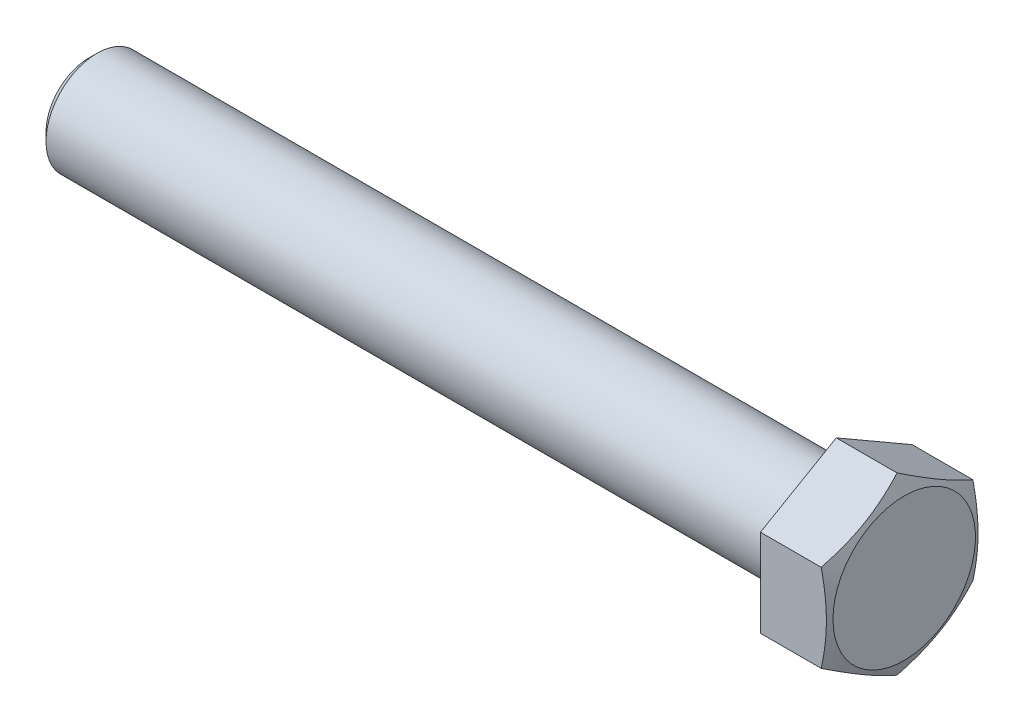
ISO-10303-21;
HEADER;
FILE_DESCRIPTION(('STEP AP214'),'2;1');
FILE_NAME('part.step','',(''),(''),'','','');
FILE_SCHEMA(('AUTOMOTIVE_DESIGN { 1 0 10303 214 1 1 1 1 }'));
ENDSEC;
DATA;
#1=APPLICATION_CONTEXT('core data for automotive mechanical design processes');
#2=APPLICATION_PROTOCOL_DEFINITION('international standard','automotive_design',2000,#1);
#3=PRODUCT_CONTEXT('',#1,'mechanical');
#4=PRODUCT('Part','Part','',(#3));
#5=PRODUCT_RELATED_PRODUCT_CATEGORY('part','',(#4));
#6=PRODUCT_DEFINITION_FORMATION('','',#4);
#7=PRODUCT_DEFINITION_CONTEXT('part definition',#1,'design');
#8=PRODUCT_DEFINITION('design','',#6,#7);
#9=PRODUCT_DEFINITION_SHAPE('','',#8);
#10=(LENGTH_UNIT() NAMED_UNIT(*) SI_UNIT(.MILLI.,.METRE.));
#11=(NAMED_UNIT(*) PLANE_ANGLE_UNIT() SI_UNIT($,.RADIAN.));
#12=(NAMED_UNIT(*) SI_UNIT($,.STERADIAN.) SOLID_ANGLE_UNIT());
#13=UNCERTAINTY_MEASURE_WITH_UNIT(LENGTH_MEASURE(1.E-05),#10,'distance_accuracy_value','');
#14=(GEOMETRIC_REPRESENTATION_CONTEXT(3) GLOBAL_UNCERTAINTY_ASSIGNED_CONTEXT((#13)) GLOBAL_UNIT_ASSIGNED_CONTEXT((#10,
#11,#12)) REPRESENTATION_CONTEXT('',''));
#15=CARTESIAN_POINT('',(0.,0.,0.));
#16=DIRECTION('',(0.,0.,1.));
#17=DIRECTION('',(1.,0.,0.));
#18=AXIS2_PLACEMENT_3D('',#15,#16,#17);
#19=CARTESIAN_POINT('',(0.,8.18290083527841,0.));
#20=DIRECTION('',(1.,0.,0.));
#21=DIRECTION('',(0.,0.,-1.));
#22=AXIS2_PLACEMENT_3D('',#19,#20,#21);
#23=PLANE('',#22);
#24=CARTESIAN_POINT('',(0.,0.,0.));
#25=DIRECTION('',(1.,0.,0.));
#26=DIRECTION('',(0.,0.,-1.));
#27=AXIS2_PLACEMENT_3D('',#24,#25,#26);
#28=CIRCLE('',#27,5.1435);
#29=CARTESIAN_POINT('',(0.,0.,-5.1435));
#30=VERTEX_POINT('',#29);
#31=EDGE_CURVE('E11',#30,#30,#28,.T.);
#32=ORIENTED_EDGE('',*,*,#31,.T.);
#33=EDGE_LOOP('',(#32));
#34=FACE_BOUND('',#33,.T.);
#35=DIRECTION('',(0.,0.5,0.866025403784439));
#36=VECTOR('',#35,1.);
#37=CARTESIAN_POINT('',(0.,4.0914504176392,-7.0866));
#38=LINE('',#37,#36);
#39=CARTESIAN_POINT('',(0.,4.0914504176392,-7.0866));
#40=VERTEX_POINT('',#39);
#41=CARTESIAN_POINT('',(0.,8.18290083527841,0.));
#42=VERTEX_POINT('',#41);
#43=EDGE_CURVE('E243',#40,#42,#38,.T.);
#44=ORIENTED_EDGE('',*,*,#43,.F.);
#45=DIRECTION('',(0.,1.,0.));
#46=VECTOR('',#45,1.);
#47=CARTESIAN_POINT('',(0.,-4.09145041763921,-7.0866));
#48=LINE('',#47,#46);
#49=CARTESIAN_POINT('',(0.,-4.09145041763921,-7.0866));
#50=VERTEX_POINT('',#49);
#51=EDGE_CURVE('E236',#50,#40,#48,.T.);
#52=ORIENTED_EDGE('',*,*,#51,.F.);
#53=DIRECTION('',(0.,0.499999999999999,-0.866025403784439));
#54=VECTOR('',#53,1.);
#55=CARTESIAN_POINT('',(0.,-8.1829008352784,0.));
#56=LINE('',#55,#54);
#57=CARTESIAN_POINT('',(0.,-8.1829008352784,0.));
#58=VERTEX_POINT('',#57);
#59=EDGE_CURVE('E238',#58,#50,#56,.T.);
#60=ORIENTED_EDGE('',*,*,#59,.F.);
#61=DIRECTION('',(0.,-0.5,-0.866025403784439));
#62=VECTOR('',#61,1.);
#63=CARTESIAN_POINT('',(0.,-4.0914504176392,7.08660000000001));
#64=LINE('',#63,#62);
#65=CARTESIAN_POINT('',(0.,-4.0914504176392,7.08660000000001));
#66=VERTEX_POINT('',#65);
#67=EDGE_CURVE('E229',#66,#58,#64,.T.);
#68=ORIENTED_EDGE('',*,*,#67,.F.);
#69=DIRECTION('',(0.,-1.,0.));
#70=VECTOR('',#69,1.);
#71=CARTESIAN_POINT('',(0.,4.09145041763921,7.08660000000001));
#72=LINE('',#71,#70);
#73=CARTESIAN_POINT('',(0.,4.09145041763921,7.08660000000001));
#74=VERTEX_POINT('',#73);
#75=EDGE_CURVE('E241',#74,#66,#72,.T.);
#76=ORIENTED_EDGE('',*,*,#75,.F.);
#77=DIRECTION('',(0.,-0.5,0.866025403784438));
#78=VECTOR('',#77,1.);
#79=CARTESIAN_POINT('',(0.,8.18290083527841,0.));
#80=LINE('',#79,#78);
#81=EDGE_CURVE('E119',#42,#74,#80,.T.);
#82=ORIENTED_EDGE('',*,*,#81,.F.);
#83=EDGE_LOOP('',(#44,#52,#60,#68,#76,#82));
#84=FACE_BOUND('',#83,.T.);
#85=ADVANCED_FACE('F45',(#34,#84),#23,.F.);
#86=CARTESIAN_POINT('',(6.35,4.0914504176392,-7.0866));
#87=DIRECTION('',(0.,-0.866025403784439,0.5));
#88=DIRECTION('',(0.,-0.5,-0.866025403784439));
#89=AXIS2_PLACEMENT_3D('',#86,#87,#88);
#90=PLANE('',#89);
#91=DIRECTION('',(-1.,0.,0.));
#92=VECTOR('',#91,1.);
#93=CARTESIAN_POINT('',(6.35,8.18290083527841,0.));
#94=LINE('',#93,#92);
#95=CARTESIAN_POINT('',(5.67731061007736,8.18290083527841,0.));
#96=VERTEX_POINT('',#95);
#97=EDGE_CURVE('E121',#96,#42,#94,.T.);
#98=ORIENTED_EDGE('',*,*,#97,.F.);
#99=CARTESIAN_POINT('',(5.67725964083577,8.18301630533225,0.000200000000013089));
#100=CARTESIAN_POINT('',(5.73498426844191,8.05224265346828,-0.226306609319698));
#101=CARTESIAN_POINT('',(5.78876680280309,7.92100668629218,-0.453613972249148));
#102=CARTESIAN_POINT('',(5.88703548005851,7.65759582233643,-0.90985497188613));
#103=CARTESIAN_POINT('',(5.93151641594971,7.52542044225308,-1.13878944570021));
#104=CARTESIAN_POINT('',(6.0097207616842,7.26019903494239,-1.59816639841724));
#105=CARTESIAN_POINT('',(6.04343900285222,7.12715262061477,-1.82860954779754));
#106=CARTESIAN_POINT('',(6.09876221501083,6.86045060232067,-2.29055099396408));
#107=CARTESIAN_POINT('',(6.12036960619603,6.72679512545318,-2.52204907060842));
#108=CARTESIAN_POINT('',(6.15022630561397,6.46168922070597,-2.98122596701711));
#109=CARTESIAN_POINT('',(6.15872487254714,6.33024590211084,-3.20889247313933));
#110=CARTESIAN_POINT('',(6.16275943678103,6.06729935157837,-3.66432925833656));
#111=CARTESIAN_POINT('',(6.15829453746928,5.93579611612587,-3.89209954349999));
#112=CARTESIAN_POINT('',(6.13661867029556,5.6731648318318,-4.34699027155438));
#113=CARTESIAN_POINT('',(6.11941811219794,5.54203656432467,-4.57411109318521));
#114=CARTESIAN_POINT('',(6.07304545639624,5.28032704553691,-5.02740527655001));
#115=CARTESIAN_POINT('',(6.0438744884099,5.14974574381042,-5.25357872565877));
#116=CARTESIAN_POINT('',(5.9886673396374,4.94184296707828,-5.6136768979935));
#117=CARTESIAN_POINT('',(5.96611276599631,4.86428398906851,-5.74801298848953));
#118=CARTESIAN_POINT('',(5.91743873398993,4.70945456271683,-6.01618542143738));
#119=CARTESIAN_POINT('',(5.89131967804329,4.63218408281466,-6.15002181855317));
#120=CARTESIAN_POINT('',(5.83563492250009,4.47747089379907,-6.41799292252917));
#121=CARTESIAN_POINT('',(5.80604923179578,4.40002999419904,-6.55212449522028));
#122=CARTESIAN_POINT('',(5.74385147845469,4.24545310294259,-6.81985952455249));
#123=CARTESIAN_POINT('',(5.71123945146082,4.16831710770631,-6.95346298739412));
#124=CARTESIAN_POINT('',(5.67725964083578,4.09133494758537,-7.0868));
#125=B_SPLINE_CURVE_WITH_KNOTS('',3,(#99,#100,#101,#102,#103,#104,#105,#106,#107,#108,#109,#110,
#111,#112,#113,#114,#115,#116,#117,#118,#119,#120,#121,#122,#123,#124),.UNSPECIFIED.,.F.,.F.,(4,
2,2,2,2,2,2,2,2,2,2,2,4),(0.,0.803574319548981,1.60759728011387,2.41200578565302,
3.21625348333088,4.00501154803446,4.79382416814302,5.58199274608049,6.37008695703105,
6.84029706564725,7.31045413289375,7.78346991165116,8.25648012013805),.UNSPECIFIED.);
#126=CARTESIAN_POINT('',(5.67731061007736,4.09145041763921,-7.0866));
#127=VERTEX_POINT('',#126);
#128=EDGE_CURVE('E103',#96,#127,#125,.T.);
#129=ORIENTED_EDGE('',*,*,#128,.T.);
#130=DIRECTION('',(-1.,0.,0.));
#131=VECTOR('',#130,1.);
#132=CARTESIAN_POINT('',(6.35,4.0914504176392,-7.0866));
#133=LINE('',#132,#131);
#134=EDGE_CURVE('E68',#127,#40,#133,.T.);
#135=ORIENTED_EDGE('',*,*,#134,.T.);
#136=ORIENTED_EDGE('',*,*,#43,.T.);
#137=EDGE_LOOP('',(#98,#129,#135,#136));
#138=FACE_BOUND('',#137,.T.);
#139=ADVANCED_FACE('F149',(#138),#90,.F.);
#140=CARTESIAN_POINT('',(6.35,8.18290083527841,0.));
#141=DIRECTION('',(0.,-0.866025403784438,-0.5));
#142=DIRECTION('',(0.,0.5,-0.866025403784438));
#143=AXIS2_PLACEMENT_3D('',#140,#141,#142);
#144=PLANE('',#143);
#145=DIRECTION('',(-1.,0.,0.));
#146=VECTOR('',#145,1.);
#147=CARTESIAN_POINT('',(6.35,4.09145041763921,7.08660000000001));
#148=LINE('',#147,#146);
#149=CARTESIAN_POINT('',(5.67731061007736,4.0914504176392,7.08660000000001));
#150=VERTEX_POINT('',#149);
#151=EDGE_CURVE('E112',#150,#74,#148,.T.);
#152=ORIENTED_EDGE('',*,*,#151,.F.);
#153=CARTESIAN_POINT('',(5.67725964083577,4.09133494758537,7.0868));
#154=CARTESIAN_POINT('',(5.73498426844191,4.22210859944934,6.86029339068029));
#155=CARTESIAN_POINT('',(5.78876680280309,4.35334456662544,6.63298602775085));
#156=CARTESIAN_POINT('',(5.88703548005851,4.61675543058119,6.17674502811386));
#157=CARTESIAN_POINT('',(5.93151641594971,4.74893081066454,5.94781055429979));
#158=CARTESIAN_POINT('',(6.0097207616842,5.01415221797522,5.48843360158275));
#159=CARTESIAN_POINT('',(6.04343900285222,5.14719863230285,5.25799045220245));
#160=CARTESIAN_POINT('',(6.09876221501083,5.41390065059694,4.79604900603591));
#161=CARTESIAN_POINT('',(6.12036960619602,5.54755612746443,4.56455092939157));
#162=CARTESIAN_POINT('',(6.15022630561396,5.81266203221165,4.10537403298288));
#163=CARTESIAN_POINT('',(6.15872487254714,5.94410535080677,3.87770752686066));
#164=CARTESIAN_POINT('',(6.16275943678103,6.20705190133925,3.42227074166344));
#165=CARTESIAN_POINT('',(6.15829453746928,6.33855513679175,3.19450045650001));
#166=CARTESIAN_POINT('',(6.13661867029556,6.60118642108582,2.73960972844561));
#167=CARTESIAN_POINT('',(6.11941811219793,6.73231468859295,2.51248890681479));
#168=CARTESIAN_POINT('',(6.07304545639623,6.99402420738071,2.05919472344999));
#169=CARTESIAN_POINT('',(6.04387448840989,7.12460550910719,1.83302127434123));
#170=CARTESIAN_POINT('',(5.9886673396374,7.33250828583934,1.4729231020065));
#171=CARTESIAN_POINT('',(5.9661127659963,7.41006726384911,1.33858701151047));
#172=CARTESIAN_POINT('',(5.91743873398992,7.56489669020079,1.07041457856262));
#173=CARTESIAN_POINT('',(5.89131967804329,7.64216717010296,0.936578181446833));
#174=CARTESIAN_POINT('',(5.83563492250009,7.79688035911854,0.668607077470833));
#175=CARTESIAN_POINT('',(5.80604923179577,7.87432125871858,0.534475504779727));
#176=CARTESIAN_POINT('',(5.74385147845469,8.02889814997502,0.266740475447522));
#177=CARTESIAN_POINT('',(5.71123945146082,8.10603414521131,0.133137012605887));
#178=CARTESIAN_POINT('',(5.67725964083578,8.18301630533225,-0.000199999999987229));
#179=B_SPLINE_CURVE_WITH_KNOTS('',3,(#153,#154,#155,#156,#157,#158,#159,#160,#161,#162,#163,
#164,#165,#166,#167,#168,#169,#170,#171,#172,#173,#174,#175,#176,#177,#178),.UNSPECIFIED.,.F.,
.F.,(4,2,2,2,2,2,2,2,2,2,2,2,4),(0.,0.80357431954898,1.60759728011386,2.41200578565302,
3.21625348333088,4.00501154803445,4.79382416814301,5.58199274608049,6.37008695703105,
6.84029706564724,7.31045413289374,7.78346991165115,8.25648012013803),.UNSPECIFIED.);
#180=EDGE_CURVE('E98',#150,#96,#179,.T.);
#181=ORIENTED_EDGE('',*,*,#180,.T.);
#182=ORIENTED_EDGE('',*,*,#97,.T.);
#183=ORIENTED_EDGE('',*,*,#81,.T.);
#184=EDGE_LOOP('',(#152,#181,#182,#183));
#185=FACE_BOUND('',#184,.T.);
#186=ADVANCED_FACE('F117',(#185),#144,.F.);
#187=CARTESIAN_POINT('',(6.35,4.09145041763921,7.08660000000001));
#188=DIRECTION('',(0.,0.,-1.));
#189=DIRECTION('',(-1.,0.,0.));
#190=AXIS2_PLACEMENT_3D('',#187,#188,#189);
#191=PLANE('',#190);
#192=DIRECTION('',(-1.,0.,0.));
#193=VECTOR('',#192,1.);
#194=CARTESIAN_POINT('',(6.35,-4.0914504176392,7.08660000000001));
#195=LINE('',#194,#193);
#196=CARTESIAN_POINT('',(5.67731061007736,-4.09145041763921,7.0866));
#197=VERTEX_POINT('',#196);
#198=EDGE_CURVE('E114',#197,#66,#195,.T.);
#199=ORIENTED_EDGE('',*,*,#198,.F.);
#200=CARTESIAN_POINT('',(3.57934101398234,-10.8221130385265,7.08660000000001));
#201=CARTESIAN_POINT('',(3.6970608265251,-10.5032304606957,7.08660000000001));
#202=CARTESIAN_POINT('',(3.81346668097632,-10.1838536520814,7.08660000000001));
#203=CARTESIAN_POINT('',(4.04290950724388,-9.54385200397452,7.08660000000001));
#204=CARTESIAN_POINT('',(4.15594608806952,-9.2232270244803,7.08660000000001));
#205=CARTESIAN_POINT('',(4.378213393869,-8.57958295632354,7.08660000000001));
#206=CARTESIAN_POINT('',(4.48743173829045,-8.25655957670765,7.08660000000001));
#207=CARTESIAN_POINT('',(4.7006596279205,-7.60880243001671,7.08660000000001));
#208=CARTESIAN_POINT('',(4.8046693318549,-7.28406871539534,7.08660000000001));
#209=CARTESIAN_POINT('',(5.00480734465554,-6.63690000136647,7.08660000000001));
#210=CARTESIAN_POINT('',(5.1010220695284,-6.31449186094321,7.08660000000001));
#211=CARTESIAN_POINT('',(5.28543385790487,-5.66735918833097,7.08660000000001));
#212=CARTESIAN_POINT('',(5.3736305825733,-5.34263455887355,7.08660000000001));
#213=CARTESIAN_POINT('',(5.53985581267927,-4.69085046575492,7.08660000000001));
#214=CARTESIAN_POINT('',(5.61789245815599,-4.36379309542186,7.08660000000001));
#215=CARTESIAN_POINT('',(5.76136105520319,-3.70691841444896,7.08660000000001));
#216=CARTESIAN_POINT('',(5.8267944100109,-3.37710141533488,7.08660000000001));
#217=CARTESIAN_POINT('',(5.92631904424136,-2.80609894004356,7.08660000000001));
#218=CARTESIAN_POINT('',(5.96407737712296,-2.56555389903237,7.08660000000001));
#219=CARTESIAN_POINT('',(6.03042987065936,-2.08320947620496,7.08660000000001));
#220=CARTESIAN_POINT('',(6.05902483253493,-1.84141020593495,7.08660000000001));
#221=CARTESIAN_POINT('',(6.10609370816598,-1.35694594642842,7.08660000000001));
#222=CARTESIAN_POINT('',(6.12457291865864,-1.1142814773495,7.08660000000001));
#223=CARTESIAN_POINT('',(6.15074600795437,-0.62836625342249,7.08660000000001));
#224=CARTESIAN_POINT('',(6.15843997244842,-0.385115503247903,7.08660000000001));
#225=CARTESIAN_POINT('',(6.16274684776516,0.102597811828056,7.08660000000001));
#226=CARTESIAN_POINT('',(6.15930894477468,0.347060833301929,7.08660000000001));
#227=CARTESIAN_POINT('',(6.14137944957125,0.835578610055077,7.08660000000001));
#228=CARTESIAN_POINT('',(6.12688770669587,1.07963335972422,7.08660000000001));
#229=CARTESIAN_POINT('',(6.0874048619863,1.56697643839187,7.08660000000001));
#230=CARTESIAN_POINT('',(6.06240982261145,1.8102644454525,7.08660000000001));
#231=CARTESIAN_POINT('',(6.00279655599724,2.2956325414133,7.08660000000001));
#232=CARTESIAN_POINT('',(5.96817851044868,2.53771265303177,7.08660000000001));
#233=CARTESIAN_POINT('',(5.82927711889676,3.39973777309047,7.08660000000001));
#234=CARTESIAN_POINT('',(5.70098592872945,4.015868511235,7.08660000000001));
#235=CARTESIAN_POINT('',(5.47967922017748,4.93290030259767,7.08660000000001));
#236=CARTESIAN_POINT('',(5.40105055646677,5.23753908379362,7.08660000000001));
#237=CARTESIAN_POINT('',(5.23597283247687,5.84470028340484,7.08660000000001));
#238=CARTESIAN_POINT('',(5.14952418772888,6.14722281335237,7.08660000000001));
#239=CARTESIAN_POINT('',(4.96995427648391,6.75167380381394,7.08660000000001));
#240=CARTESIAN_POINT('',(4.87680594754326,7.05359413309933,7.08660000000001));
#241=CARTESIAN_POINT('',(4.68538917821675,7.6558067852736,7.08660000000001));
#242=CARTESIAN_POINT('',(4.58712069102852,7.95609909325334,7.08660000000001));
#243=CARTESIAN_POINT('',(4.386476784684,8.55516665694746,7.08660000000001));
#244=CARTESIAN_POINT('',(4.28410306500147,8.85394248390486,7.08660000000001));
#245=CARTESIAN_POINT('',(4.07596459102404,9.45031251322853,7.08660000000001));
#246=CARTESIAN_POINT('',(3.97019978746287,9.74790669835705,7.08660000000001));
#247=CARTESIAN_POINT('',(3.64901478410276,10.6384621293328,7.08660000000001));
#248=CARTESIAN_POINT('',(3.42945485483155,11.2299295560444,7.08660000000001));
#249=CARTESIAN_POINT('',(2.98268967135271,12.4100238931381,7.08660000000001));
#250=CARTESIAN_POINT('',(2.75548358026536,12.9986504844733,7.08660000000001));
#251=CARTESIAN_POINT('',(2.29792303408043,14.1678084306438,7.08660000000001));
#252=CARTESIAN_POINT('',(2.06762374085286,14.7483614100218,7.08660000000001));
#253=CARTESIAN_POINT('',(1.71922089692624,15.6179430097297,7.08660000000001));
#254=CARTESIAN_POINT('',(1.6026048978233,15.9075696248717,7.08660000000001));
#255=CARTESIAN_POINT('',(1.36850511519232,16.4864703338818,7.08660000000001));
#256=CARTESIAN_POINT('',(1.25102133597472,16.7757444294926,7.08660000000001));
#257=CARTESIAN_POINT('',(1.13316480798833,17.0648666782435,7.08660000000001));
#258=B_SPLINE_CURVE_WITH_KNOTS('',3,(#200,#201,#202,#203,#204,#205,#206,#207,#208,#209,#210,
#211,#212,#213,#214,#215,#216,#217,#218,#219,#220,#221,#222,#223,#224,#225,#226,#227,#228,#229,
#230,#231,#232,#233,#234,#235,#236,#237,#238,#239,#240,#241,#242,#243,#244,#245,#246,#247,#248,
#249,#250,#251,#252,#253,#254,#255,#256,#257),.UNSPECIFIED.,.F.,.F.,(4,2,2,2,2,2,2,2,2,2,2,2,2,
2,2,2,2,2,2,2,2,2,2,2,2,2,2,2,4),(0.,1.01976313202464,2.0396441463499,3.06257243957305,
4.0854695415403,5.09476376616394,6.10410062305953,7.11262377824851,8.12103458053186,
8.85135521541389,9.58161197556924,10.3114859972767,11.0413542199536,11.7745587723033,
12.5077733183153,13.2412629818912,13.9747387974787,15.860459858621,16.8042963676543,
17.7480827533707,18.6959224236646,19.6437707594949,20.5912306783425,21.5387043682982,
23.4313287565979,25.32416097251,27.1978300917938,28.1344965228614,29.071158304447),.UNSPECIFIED.);
#259=EDGE_CURVE('E101',#197,#150,#258,.T.);
#260=ORIENTED_EDGE('',*,*,#259,.T.);
#261=ORIENTED_EDGE('',*,*,#151,.T.);
#262=ORIENTED_EDGE('',*,*,#75,.T.);
#263=EDGE_LOOP('',(#199,#260,#261,#262));
#264=FACE_BOUND('',#263,.T.);
#265=ADVANCED_FACE('F110',(#264),#191,.F.);
#266=CARTESIAN_POINT('',(6.35,-4.0914504176392,7.08660000000001));
#267=DIRECTION('',(0.,0.866025403784439,-0.5));
#268=DIRECTION('',(0.,0.5,0.866025403784439));
#269=AXIS2_PLACEMENT_3D('',#266,#267,#268);
#270=PLANE('',#269);
#271=DIRECTION('',(-1.,0.,0.));
#272=VECTOR('',#271,1.);
#273=CARTESIAN_POINT('',(6.35,-8.1829008352784,0.));
#274=LINE('',#273,#272);
#275=CARTESIAN_POINT('',(5.67731061007736,-8.18290083527841,0.));
#276=VERTEX_POINT('',#275);
#277=EDGE_CURVE('E125',#276,#58,#274,.T.);
#278=ORIENTED_EDGE('',*,*,#277,.F.);
#279=CARTESIAN_POINT('',(5.67725964083578,-8.18301630533224,-0.0001999999999975));
#280=CARTESIAN_POINT('',(5.73498426844192,-8.05224265346827,0.226306609319714));
#281=CARTESIAN_POINT('',(5.78876680280309,-7.92100668629218,0.453613972249163));
#282=CARTESIAN_POINT('',(5.88703548005851,-7.65759582233642,0.909854971886144));
#283=CARTESIAN_POINT('',(5.93151641594972,-7.52542044225308,1.13878944570022));
#284=CARTESIAN_POINT('',(6.0097207616842,-7.26019903494239,1.59816639841725));
#285=CARTESIAN_POINT('',(6.04343900285222,-7.12715262061477,1.82860954779756));
#286=CARTESIAN_POINT('',(6.09876221501083,-6.86045060232067,2.29055099396409));
#287=CARTESIAN_POINT('',(6.12036960619603,-6.72679512545318,2.52204907060844));
#288=CARTESIAN_POINT('',(6.15022630561397,-6.46168922070597,2.98122596701712));
#289=CARTESIAN_POINT('',(6.15872487254714,-6.33024590211084,3.20889247313935));
#290=CARTESIAN_POINT('',(6.16275943678103,-6.06729935157837,3.66432925833657));
#291=CARTESIAN_POINT('',(6.15829453746928,-5.93579611612586,3.8920995435));
#292=CARTESIAN_POINT('',(6.13661867029556,-5.67316483183179,4.34699027155439));
#293=CARTESIAN_POINT('',(6.11941811219794,-5.54203656432467,4.57411109318522));
#294=CARTESIAN_POINT('',(6.07304545639623,-5.28032704553691,5.02740527655001));
#295=CARTESIAN_POINT('',(6.0438744884099,-5.14974574381042,5.25357872565877));
#296=CARTESIAN_POINT('',(5.9886673396374,-4.94184296707828,5.6136768979935));
#297=CARTESIAN_POINT('',(5.96611276599631,-4.86428398906851,5.74801298848954));
#298=CARTESIAN_POINT('',(5.91743873398992,-4.70945456271683,6.01618542143739));
#299=CARTESIAN_POINT('',(5.89131967804329,-4.63218408281466,6.15002181855318));
#300=CARTESIAN_POINT('',(5.83563492250009,-4.47747089379907,6.41799292252918));
#301=CARTESIAN_POINT('',(5.80604923179577,-4.40002999419904,6.55212449522029));
#302=CARTESIAN_POINT('',(5.74385147845469,-4.24545310294259,6.81985952455249));
#303=CARTESIAN_POINT('',(5.71123945146082,-4.16831710770631,6.95346298739413));
#304=CARTESIAN_POINT('',(5.67725964083578,-4.09133494758537,7.0868));
#305=B_SPLINE_CURVE_WITH_KNOTS('',3,(#279,#280,#281,#282,#283,#284,#285,#286,#287,#288,#289,
#290,#291,#292,#293,#294,#295,#296,#297,#298,#299,#300,#301,#302,#303,#304),.UNSPECIFIED.,.F.,
.F.,(4,2,2,2,2,2,2,2,2,2,2,2,4),(0.,0.803574319548979,1.60759728011386,2.41200578565302,
3.21625348333088,4.00501154803445,4.79382416814301,5.58199274608048,6.37008695703104,
6.84029706564724,7.31045413289374,7.78346991165115,8.25648012013804),.UNSPECIFIED.);
#306=EDGE_CURVE('E115',#276,#197,#305,.T.);
#307=ORIENTED_EDGE('',*,*,#306,.T.);
#308=ORIENTED_EDGE('',*,*,#198,.T.);
#309=ORIENTED_EDGE('',*,*,#67,.T.);
#310=EDGE_LOOP('',(#278,#307,#308,#309));
#311=FACE_BOUND('',#310,.T.);
#312=ADVANCED_FACE('F218',(#311),#270,.F.);
#313=CARTESIAN_POINT('',(6.35,-8.1829008352784,0.));
#314=DIRECTION('',(0.,0.866025403784439,0.499999999999999));
#315=DIRECTION('',(0.,-0.499999999999999,0.866025403784439));
#316=AXIS2_PLACEMENT_3D('',#313,#314,#315);
#317=PLANE('',#316);
#318=DIRECTION('',(-1.,0.,0.));
#319=VECTOR('',#318,1.);
#320=CARTESIAN_POINT('',(6.35,-4.09145041763921,-7.0866));
#321=LINE('',#320,#319);
#322=CARTESIAN_POINT('',(5.67731061007736,-4.09145041763921,-7.0866));
#323=VERTEX_POINT('',#322);
#324=EDGE_CURVE('E232',#323,#50,#321,.T.);
#325=ORIENTED_EDGE('',*,*,#324,.F.);
#326=CARTESIAN_POINT('',(5.67725964083578,-4.09133494758537,-7.0868));
#327=CARTESIAN_POINT('',(5.73498426844192,-4.22210859944933,-6.86029339068029));
#328=CARTESIAN_POINT('',(5.78876680280309,-4.35334456662544,-6.63298602775084));
#329=CARTESIAN_POINT('',(5.88703548005851,-4.61675543058119,-6.17674502811386));
#330=CARTESIAN_POINT('',(5.93151641594971,-4.74893081066453,-5.94781055429978));
#331=CARTESIAN_POINT('',(6.0097207616842,-5.01415221797522,-5.48843360158275));
#332=CARTESIAN_POINT('',(6.04343900285222,-5.14719863230284,-5.25799045220245));
#333=CARTESIAN_POINT('',(6.09876221501083,-5.41390065059694,-4.79604900603591));
#334=CARTESIAN_POINT('',(6.12036960619603,-5.54755612746443,-4.56455092939156));
#335=CARTESIAN_POINT('',(6.15022630561397,-5.81266203221164,-4.10537403298288));
#336=CARTESIAN_POINT('',(6.15872487254714,-5.94410535080677,-3.87770752686066));
#337=CARTESIAN_POINT('',(6.16275943678103,-6.20705190133924,-3.42227074166343));
#338=CARTESIAN_POINT('',(6.15829453746928,-6.33855513679175,-3.1945004565));
#339=CARTESIAN_POINT('',(6.13661867029556,-6.60118642108581,-2.73960972844561));
#340=CARTESIAN_POINT('',(6.11941811219794,-6.73231468859294,-2.51248890681478));
#341=CARTESIAN_POINT('',(6.07304545639623,-6.9940242073807,-2.05919472344999));
#342=CARTESIAN_POINT('',(6.0438744884099,-7.12460550910719,-1.83302127434123));
#343=CARTESIAN_POINT('',(5.9886673396374,-7.33250828583933,-1.4729231020065));
#344=CARTESIAN_POINT('',(5.96611276599631,-7.4100672638491,-1.33858701151046));
#345=CARTESIAN_POINT('',(5.91743873398992,-7.56489669020078,-1.07041457856261));
#346=CARTESIAN_POINT('',(5.89131967804329,-7.64216717010295,-0.936578181446825));
#347=CARTESIAN_POINT('',(5.83563492250009,-7.79688035911853,-0.668607077470823));
#348=CARTESIAN_POINT('',(5.80604923179578,-7.87432125871857,-0.534475504779716));
#349=CARTESIAN_POINT('',(5.74385147845469,-8.02889814997502,-0.266740475447509));
#350=CARTESIAN_POINT('',(5.71123945146082,-8.1060341452113,-0.133137012605873));
#351=CARTESIAN_POINT('',(5.67725964083578,-8.18301630533224,0.000200000000002315));
#352=B_SPLINE_CURVE_WITH_KNOTS('',3,(#326,#327,#328,#329,#330,#331,#332,#333,#334,#335,#336,
#337,#338,#339,#340,#341,#342,#343,#344,#345,#346,#347,#348,#349,#350,#351),.UNSPECIFIED.,.F.,
.F.,(4,2,2,2,2,2,2,2,2,2,2,2,4),(0.,0.803574319548979,1.60759728011386,2.41200578565302,
3.21625348333088,4.00501154803445,4.79382416814301,5.58199274608048,6.37008695703104,
6.84029706564724,7.31045413289374,7.78346991165115,8.25648012013804),.UNSPECIFIED.);
#353=EDGE_CURVE('E60',#323,#276,#352,.T.);
#354=ORIENTED_EDGE('',*,*,#353,.T.);
#355=ORIENTED_EDGE('',*,*,#277,.T.);
#356=ORIENTED_EDGE('',*,*,#59,.T.);
#357=EDGE_LOOP('',(#325,#354,#355,#356));
#358=FACE_BOUND('',#357,.T.);
#359=ADVANCED_FACE('F165',(#358),#317,.F.);
#360=CARTESIAN_POINT('',(6.35,-4.09145041763921,-7.0866));
#361=DIRECTION('',(0.,0.,1.));
#362=DIRECTION('',(1.,0.,0.));
#363=AXIS2_PLACEMENT_3D('',#360,#361,#362);
#364=PLANE('',#363);
#365=ORIENTED_EDGE('',*,*,#134,.F.);
#366=CARTESIAN_POINT('',(3.57934101398234,-10.8221130385265,-7.0866));
#367=CARTESIAN_POINT('',(3.6970608265251,-10.5032304606957,-7.0866));
#368=CARTESIAN_POINT('',(3.81346668097633,-10.1838536520814,-7.0866));
#369=CARTESIAN_POINT('',(4.04290950724388,-9.54385200397451,-7.0866));
#370=CARTESIAN_POINT('',(4.15594608806952,-9.2232270244803,-7.0866));
#371=CARTESIAN_POINT('',(4.378213393869,-8.57958295632354,-7.0866));
#372=CARTESIAN_POINT('',(4.48743173829045,-8.25655957670765,-7.0866));
#373=CARTESIAN_POINT('',(4.7006596279205,-7.60880243001671,-7.0866));
#374=CARTESIAN_POINT('',(4.80466933185491,-7.28406871539534,-7.0866));
#375=CARTESIAN_POINT('',(5.00480734465554,-6.63690000136647,-7.0866));
#376=CARTESIAN_POINT('',(5.10102206952841,-6.31449186094321,-7.0866));
#377=CARTESIAN_POINT('',(5.28543385790487,-5.66735918833097,-7.0866));
#378=CARTESIAN_POINT('',(5.3736305825733,-5.34263455887356,-7.0866));
#379=CARTESIAN_POINT('',(5.53985581267928,-4.69085046575492,-7.0866));
#380=CARTESIAN_POINT('',(5.617892458156,-4.36379309542186,-7.0866));
#381=CARTESIAN_POINT('',(5.76136105520319,-3.70691841444897,-7.0866));
#382=CARTESIAN_POINT('',(5.8267944100109,-3.37710141533488,-7.0866));
#383=CARTESIAN_POINT('',(5.92631904424136,-2.80609894004357,-7.0866));
#384=CARTESIAN_POINT('',(5.96407737712296,-2.56555389903238,-7.0866));
#385=CARTESIAN_POINT('',(6.03042987065936,-2.08320947620497,-7.0866));
#386=CARTESIAN_POINT('',(6.05902483253494,-1.84141020593496,-7.0866));
#387=CARTESIAN_POINT('',(6.10609370816599,-1.35694594642842,-7.0866));
#388=CARTESIAN_POINT('',(6.12457291865864,-1.11428147734951,-7.0866));
#389=CARTESIAN_POINT('',(6.15074600795437,-0.628366253422496,-7.0866));
#390=CARTESIAN_POINT('',(6.15843997244842,-0.385115503247909,-7.0866));
#391=CARTESIAN_POINT('',(6.16274684776517,0.10259781182805,-7.0866));
#392=CARTESIAN_POINT('',(6.15930894477469,0.347060833301923,-7.0866));
#393=CARTESIAN_POINT('',(6.14137944957125,0.83557861005507,-7.0866));
#394=CARTESIAN_POINT('',(6.12688770669588,1.07963335972421,-7.0866));
#395=CARTESIAN_POINT('',(6.0874048619863,1.56697643839186,-7.0866));
#396=CARTESIAN_POINT('',(6.06240982261146,1.81026444545249,-7.0866));
#397=CARTESIAN_POINT('',(6.00279655599724,2.2956325414133,-7.0866));
#398=CARTESIAN_POINT('',(5.96817851044869,2.53771265303177,-7.0866));
#399=CARTESIAN_POINT('',(5.82927711889677,3.39973777309047,-7.0866));
#400=CARTESIAN_POINT('',(5.70098592872945,4.01586851123499,-7.0866));
#401=CARTESIAN_POINT('',(5.47967922017749,4.93290030259766,-7.0866));
#402=CARTESIAN_POINT('',(5.40105055646678,5.23753908379361,-7.0866));
#403=CARTESIAN_POINT('',(5.23597283247688,5.84470028340483,-7.0866));
#404=CARTESIAN_POINT('',(5.14952418772888,6.14722281335237,-7.0866));
#405=CARTESIAN_POINT('',(4.96995427648392,6.75167380381394,-7.0866));
#406=CARTESIAN_POINT('',(4.87680594754327,7.05359413309933,-7.0866));
#407=CARTESIAN_POINT('',(4.68538917821675,7.65580678527359,-7.0866));
#408=CARTESIAN_POINT('',(4.58712069102853,7.95609909325333,-7.0866));
#409=CARTESIAN_POINT('',(4.386476784684,8.55516665694746,-7.0866));
#410=CARTESIAN_POINT('',(4.28410306500147,8.85394248390486,-7.0866));
#411=CARTESIAN_POINT('',(4.07596459102404,9.45031251322853,-7.0866));
#412=CARTESIAN_POINT('',(3.97019978746288,9.74790669835705,-7.0866));
#413=CARTESIAN_POINT('',(3.64901478410276,10.6384621293328,-7.0866));
#414=CARTESIAN_POINT('',(3.42945485483155,11.2299295560444,-7.0866));
#415=CARTESIAN_POINT('',(2.98268967135271,12.4100238931381,-7.0866));
#416=CARTESIAN_POINT('',(2.75548358026536,12.9986504844733,-7.0866));
#417=CARTESIAN_POINT('',(2.29792303408044,14.1678084306438,-7.0866));
#418=CARTESIAN_POINT('',(2.06762374085287,14.7483614100218,-7.0866));
#419=CARTESIAN_POINT('',(1.71922089692624,15.6179430097296,-7.0866));
#420=CARTESIAN_POINT('',(1.6026048978233,15.9075696248717,-7.0866));
#421=CARTESIAN_POINT('',(1.36850511519232,16.4864703338818,-7.0866));
#422=CARTESIAN_POINT('',(1.25102133597472,16.7757444294926,-7.0866));
#423=CARTESIAN_POINT('',(1.13316480798833,17.0648666782435,-7.0866));
#424=B_SPLINE_CURVE_WITH_KNOTS('',3,(#366,#367,#368,#369,#370,#371,#372,#373,#374,#375,#376,
#377,#378,#379,#380,#381,#382,#383,#384,#385,#386,#387,#388,#389,#390,#391,#392,#393,#394,#395,
#396,#397,#398,#399,#400,#401,#402,#403,#404,#405,#406,#407,#408,#409,#410,#411,#412,#413,#414,
#415,#416,#417,#418,#419,#420,#421,#422,#423),.UNSPECIFIED.,.F.,.F.,(4,2,2,2,2,2,2,2,2,2,2,2,2,
2,2,2,2,2,2,2,2,2,2,2,2,2,2,2,4),(0.,1.01976313202464,2.0396441463499,3.06257243957305,
4.08546954154029,5.09476376616394,6.10410062305952,7.1126237782485,8.12103458053186,
8.85135521541388,9.58161197556923,10.3114859972767,11.0413542199536,11.7745587723032,
12.5077733183153,13.2412629818912,13.9747387974787,15.860459858621,16.8042963676543,
17.7480827533707,18.6959224236646,19.6437707594949,20.5912306783425,21.5387043682982,
23.4313287565979,25.32416097251,27.1978300917938,28.1344965228614,29.071158304447),.UNSPECIFIED.);
#425=EDGE_CURVE('E170',#127,#323,#424,.F.);
#426=ORIENTED_EDGE('',*,*,#425,.T.);
#427=ORIENTED_EDGE('',*,*,#324,.T.);
#428=ORIENTED_EDGE('',*,*,#51,.T.);
#429=EDGE_LOOP('',(#365,#426,#427,#428));
#430=FACE_BOUND('',#429,.T.);
#431=ADVANCED_FACE('F161',(#430),#364,.F.);
#432=CARTESIAN_POINT('',(6.35,0.,0.));
#433=DIRECTION('',(-1.,0.,0.));
#434=DIRECTION('',(0.,0.,1.));
#435=AXIS2_PLACEMENT_3D('',#432,#433,#434);
#436=CONICAL_SURFACE('',#435,6.65890083527841,1.15511944756553);
#437=CARTESIAN_POINT('',(6.35,0.,0.));
#438=DIRECTION('',(-1.,0.,0.));
#439=DIRECTION('',(0.,0.,1.));
#440=AXIS2_PLACEMENT_3D('',#437,#438,#439);
#441=CIRCLE('',#440,6.65890083527841);
#442=CARTESIAN_POINT('',(6.35,0.,6.65890083527841));
#443=VERTEX_POINT('',#442);
#444=EDGE_CURVE('E177',#443,#443,#441,.T.);
#445=ORIENTED_EDGE('',*,*,#444,.T.);
#446=EDGE_LOOP('',(#445));
#447=FACE_BOUND('',#446,.T.);
#448=ORIENTED_EDGE('',*,*,#180,.F.);
#449=ORIENTED_EDGE('',*,*,#259,.F.);
#450=ORIENTED_EDGE('',*,*,#306,.F.);
#451=ORIENTED_EDGE('',*,*,#353,.F.);
#452=ORIENTED_EDGE('',*,*,#425,.F.);
#453=ORIENTED_EDGE('',*,*,#128,.F.);
#454=EDGE_LOOP('',(#448,#449,#450,#451,#452,#453));
#455=FACE_BOUND('',#454,.T.);
#456=ADVANCED_FACE('F100',(#447,#455),#436,.T.);
#457=CARTESIAN_POINT('',(6.35,8.18290083527841,0.));
#458=DIRECTION('',(1.,0.,0.));
#459=DIRECTION('',(0.,0.,-1.));
#460=AXIS2_PLACEMENT_3D('',#457,#458,#459);
#461=PLANE('',#460);
#462=ORIENTED_EDGE('',*,*,#444,.F.);
#463=EDGE_LOOP('',(#462));
#464=FACE_BOUND('',#463,.T.);
#465=ADVANCED_FACE('F159',(#464),#461,.T.);
#466=CARTESIAN_POINT('',(-69.85,0.,0.));
#467=DIRECTION('',(1.,0.,0.));
#468=DIRECTION('',(0.,0.,-1.));
#469=AXIS2_PLACEMENT_3D('',#466,#467,#468);
#470=CYLINDRICAL_SURFACE('',#469,4.7625);
#471=CARTESIAN_POINT('',(-0.381000000000006,0.,0.));
#472=DIRECTION('',(1.,0.,0.));
#473=DIRECTION('',(0.,0.,-1.));
#474=AXIS2_PLACEMENT_3D('',#471,#472,#473);
#475=CIRCLE('',#474,4.7625);
#476=CARTESIAN_POINT('',(-0.381000000000006,0.,-4.7625));
#477=VERTEX_POINT('',#476);
#478=EDGE_CURVE('E53',#477,#477,#475,.F.);
#479=ORIENTED_EDGE('',*,*,#478,.T.);
#480=EDGE_LOOP('',(#479));
#481=FACE_BOUND('',#480,.T.);
#482=CARTESIAN_POINT('',(-69.088,0.,0.));
#483=DIRECTION('',(-1.,0.,0.));
#484=DIRECTION('',(0.,0.,1.));
#485=AXIS2_PLACEMENT_3D('',#482,#483,#484);
#486=CIRCLE('',#485,4.7625);
#487=CARTESIAN_POINT('',(-69.088,0.,4.7625));
#488=VERTEX_POINT('',#487);
#489=EDGE_CURVE('E131',#488,#488,#486,.F.);
#490=ORIENTED_EDGE('',*,*,#489,.T.);
#491=EDGE_LOOP('',(#490));
#492=FACE_BOUND('',#491,.T.);
#493=ADVANCED_FACE('F136',(#481,#492),#470,.T.);
#494=CARTESIAN_POINT('',(-69.85,0.,0.));
#495=DIRECTION('',(-1.,0.,0.));
#496=DIRECTION('',(0.,0.,1.));
#497=AXIS2_PLACEMENT_3D('',#494,#495,#496);
#498=PLANE('',#497);
#499=CARTESIAN_POINT('',(-69.85,0.,0.));
#500=DIRECTION('',(-1.,0.,0.));
#501=DIRECTION('',(0.,0.,1.));
#502=AXIS2_PLACEMENT_3D('',#499,#500,#501);
#503=CIRCLE('',#502,4.00050000000002);
#504=CARTESIAN_POINT('',(-69.85,0.,4.00050000000002));
#505=VERTEX_POINT('',#504);
#506=EDGE_CURVE('E123',#505,#505,#503,.T.);
#507=ORIENTED_EDGE('',*,*,#506,.T.);
#508=EDGE_LOOP('',(#507));
#509=FACE_BOUND('',#508,.T.);
#510=ADVANCED_FACE('F145',(#509),#498,.T.);
#511=CARTESIAN_POINT('',(-69.85,0.,0.));
#512=DIRECTION('',(1.,0.,0.));
#513=DIRECTION('',(0.,0.,-1.));
#514=AXIS2_PLACEMENT_3D('',#511,#512,#513);
#515=CONICAL_SURFACE('',#514,4.00050000000002,0.785398163397438);
#516=ORIENTED_EDGE('',*,*,#489,.F.);
#517=EDGE_LOOP('',(#516));
#518=FACE_BOUND('',#517,.T.);
#519=ORIENTED_EDGE('',*,*,#506,.F.);
#520=EDGE_LOOP('',(#519));
#521=FACE_BOUND('',#520,.T.);
#522=ADVANCED_FACE('F140',(#518,#521),#515,.T.);
#523=CARTESIAN_POINT('',(-0.381000000000006,0.,0.));
#524=DIRECTION('',(1.,0.,0.));
#525=DIRECTION('',(0.,0.,-1.));
#526=AXIS2_PLACEMENT_3D('',#523,#524,#525);
#527=TOROIDAL_SURFACE('',#526,5.1435,0.381);
#528=ORIENTED_EDGE('',*,*,#31,.F.);
#529=EDGE_LOOP('',(#528));
#530=FACE_BOUND('',#529,.T.);
#531=ORIENTED_EDGE('',*,*,#478,.F.);
#532=EDGE_LOOP('',(#531));
#533=FACE_BOUND('',#532,.T.);
#534=ADVANCED_FACE('F47',(#530,#533),#527,.F.);
#535=CLOSED_SHELL('',(#85,#139,#186,#265,#312,#359,#431,#456,#465,#493,#510,#522,#534));
#536=MANIFOLD_SOLID_BREP('B2',#535);
#537=ADVANCED_BREP_SHAPE_REPRESENTATION('',(#18,#536),#14);
#538=SHAPE_DEFINITION_REPRESENTATION(#9,#537);
ENDSEC;
END-ISO-10303-21;
